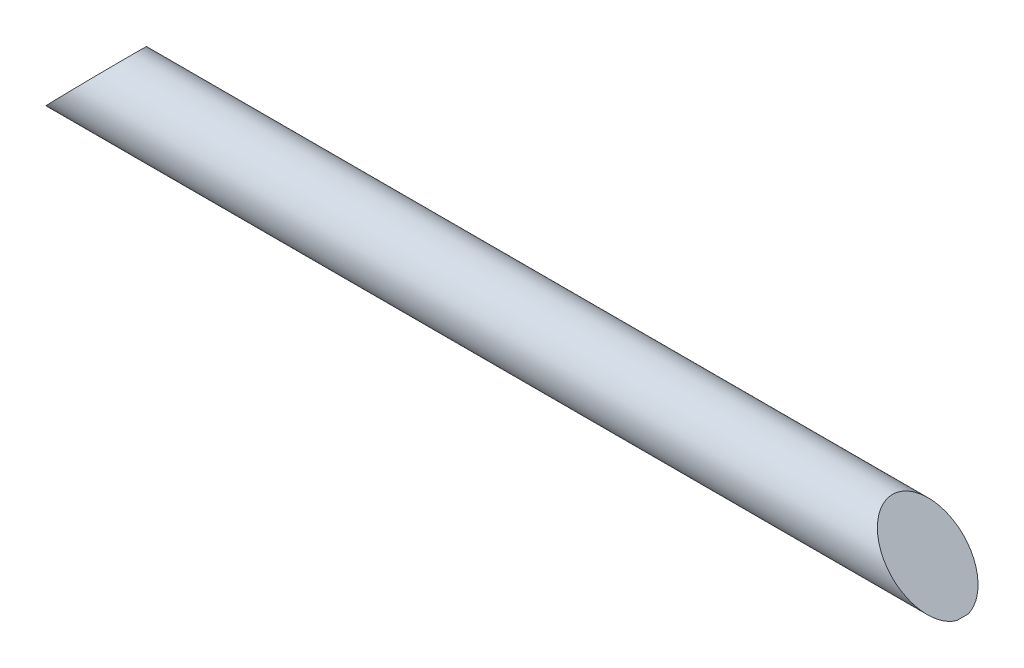
ISO-10303-21;
HEADER;
FILE_DESCRIPTION(('STEP AP214'),'2;1');
FILE_NAME('part.step','',(''),(''),'','','');
FILE_SCHEMA(('AUTOMOTIVE_DESIGN { 1 0 10303 214 1 1 1 1 }'));
ENDSEC;
DATA;
#1=APPLICATION_CONTEXT('core data for automotive mechanical design processes');
#2=APPLICATION_PROTOCOL_DEFINITION('international standard','automotive_design',2000,#1);
#3=PRODUCT_CONTEXT('',#1,'mechanical');
#4=PRODUCT('Part','Part','',(#3));
#5=PRODUCT_RELATED_PRODUCT_CATEGORY('part','',(#4));
#6=PRODUCT_DEFINITION_FORMATION('','',#4);
#7=PRODUCT_DEFINITION_CONTEXT('part definition',#1,'design');
#8=PRODUCT_DEFINITION('design','',#6,#7);
#9=PRODUCT_DEFINITION_SHAPE('','',#8);
#10=(LENGTH_UNIT() NAMED_UNIT(*) SI_UNIT(.MILLI.,.METRE.));
#11=(NAMED_UNIT(*) PLANE_ANGLE_UNIT() SI_UNIT($,.RADIAN.));
#12=(NAMED_UNIT(*) SI_UNIT($,.STERADIAN.) SOLID_ANGLE_UNIT());
#13=UNCERTAINTY_MEASURE_WITH_UNIT(LENGTH_MEASURE(1.E-05),#10,'distance_accuracy_value','');
#14=(GEOMETRIC_REPRESENTATION_CONTEXT(3) GLOBAL_UNCERTAINTY_ASSIGNED_CONTEXT((#13)) GLOBAL_UNIT_ASSIGNED_CONTEXT((#10,
#11,#12)) REPRESENTATION_CONTEXT('',''));
#15=CARTESIAN_POINT('',(0.,0.,0.));
#16=DIRECTION('',(0.,0.,1.));
#17=DIRECTION('',(1.,0.,0.));
#18=AXIS2_PLACEMENT_3D('',#15,#16,#17);
#19=CARTESIAN_POINT('',(1600.,0.,-63.75));
#20=DIRECTION('',(-1.,0.,0.));
#21=DIRECTION('',(0.,0.,1.));
#22=AXIS2_PLACEMENT_3D('',#19,#20,#21);
#23=CYLINDRICAL_SURFACE('',#22,63.7499999999999);
#24=CARTESIAN_POINT('',(62.5000000000004,0.,-63.7499999999999));
#25=DIRECTION('',(-0.714072839144578,0.700071410926058,0.));
#26=DIRECTION('',(-0.700071410926058,-0.714072839144578,0.));
#27=AXIS2_PLACEMENT_3D('',#24,#25,#26);
#28=ELLIPSE('',#27,89.2766066783454,63.7499999999999);
#29=CARTESIAN_POINT('',(0.772229127835502,-62.9623262896077,-73.7403937960889));
#30=VERTEX_POINT('',#29);
#31=CARTESIAN_POINT('',(0.772229127835502,-62.9623262896077,-53.7596062039108));
#32=VERTEX_POINT('',#31);
#33=EDGE_CURVE('E43',#30,#32,#28,.F.);
#34=ORIENTED_EDGE('',*,*,#33,.T.);
#35=DIRECTION('',(-1.,0.,0.));
#36=VECTOR('',#35,1.);
#37=CARTESIAN_POINT('',(1600.,-62.9623262896077,-53.7596062039096));
#38=LINE('',#37,#36);
#39=CARTESIAN_POINT('',(1599.22777087216,-62.9623262896077,-53.7596062039096));
#40=VERTEX_POINT('',#39);
#41=EDGE_CURVE('E50',#32,#40,#38,.F.);
#42=ORIENTED_EDGE('',*,*,#41,.T.);
#43=CARTESIAN_POINT('',(1537.5,0.,-63.75));
#44=DIRECTION('',(-0.714072839144578,-0.700071410926058,0.));
#45=DIRECTION('',(-0.700071410926058,0.714072839144578,0.));
#46=AXIS2_PLACEMENT_3D('',#43,#44,#45);
#47=ELLIPSE('',#46,89.2766066783454,63.7499999999999);
#48=CARTESIAN_POINT('',(1599.22777087216,-62.9623262896077,-73.7403937960904));
#49=VERTEX_POINT('',#48);
#50=EDGE_CURVE('E67',#49,#40,#47,.F.);
#51=ORIENTED_EDGE('',*,*,#50,.F.);
#52=DIRECTION('',(-1.,0.,0.));
#53=VECTOR('',#52,1.);
#54=CARTESIAN_POINT('',(1600.,-62.9623262896077,-73.7403937960904));
#55=LINE('',#54,#53);
#56=EDGE_CURVE('E60',#49,#30,#55,.T.);
#57=ORIENTED_EDGE('',*,*,#56,.T.);
#58=EDGE_LOOP('',(#34,#42,#51,#57));
#59=FACE_BOUND('',#58,.T.);
#60=ADVANCED_FACE('F36',(#59),#23,.T.);
#61=CARTESIAN_POINT('',(783.971280141148,768.599294256028,-127.5));
#62=DIRECTION('',(-0.714072839144578,-0.700071410926058,0.));
#63=DIRECTION('',(0.700071410926058,-0.714072839144578,0.));
#64=AXIS2_PLACEMENT_3D('',#61,#62,#63);
#65=PLANE('',#64);
#66=DIRECTION('',(0.,0.,1.));
#67=VECTOR('',#66,1.);
#68=CARTESIAN_POINT('',(1599.22777087216,-62.9623262896079,-127.5));
#69=LINE('',#68,#67);
#70=EDGE_CURVE('E54',#49,#40,#69,.T.);
#71=ORIENTED_EDGE('',*,*,#70,.F.);
#72=ORIENTED_EDGE('',*,*,#50,.T.);
#73=EDGE_LOOP('',(#71,#72));
#74=FACE_BOUND('',#73,.T.);
#75=ADVANCED_FACE('F74',(#74),#65,.F.);
#76=CARTESIAN_POINT('',(31.8687512252499,-31.2438737502451,-127.5));
#77=DIRECTION('',(-0.714072839144578,0.700071410926058,0.));
#78=DIRECTION('',(-0.700071410926058,-0.714072839144578,0.));
#79=AXIS2_PLACEMENT_3D('',#76,#77,#78);
#80=PLANE('',#79);
#81=ORIENTED_EDGE('',*,*,#33,.F.);
#82=DIRECTION('',(0.,0.,1.));
#83=VECTOR('',#82,1.);
#84=CARTESIAN_POINT('',(0.772229127835502,-62.9623262896077,-127.5));
#85=LINE('',#84,#83);
#86=EDGE_CURVE('E11',#30,#32,#85,.T.);
#87=ORIENTED_EDGE('',*,*,#86,.T.);
#88=EDGE_LOOP('',(#81,#87));
#89=FACE_BOUND('',#88,.T.);
#90=ADVANCED_FACE('F69',(#89),#80,.T.);
#91=CARTESIAN_POINT('',(1600.,-62.9623262896077,0.));
#92=DIRECTION('',(0.,-1.,0.));
#93=DIRECTION('',(0.,0.,-1.));
#94=AXIS2_PLACEMENT_3D('',#91,#92,#93);
#95=PLANE('',#94);
#96=ORIENTED_EDGE('',*,*,#70,.T.);
#97=ORIENTED_EDGE('',*,*,#41,.F.);
#98=ORIENTED_EDGE('',*,*,#86,.F.);
#99=ORIENTED_EDGE('',*,*,#56,.F.);
#100=EDGE_LOOP('',(#96,#97,#98,#99));
#101=FACE_BOUND('',#100,.T.);
#102=ADVANCED_FACE('F59',(#101),#95,.T.);
#103=CLOSED_SHELL('',(#60,#75,#90,#102));
#104=MANIFOLD_SOLID_BREP('B2',#103);
#105=ADVANCED_BREP_SHAPE_REPRESENTATION('',(#18,#104),#14);
#106=SHAPE_DEFINITION_REPRESENTATION(#9,#105);
ENDSEC;
END-ISO-10303-21;
